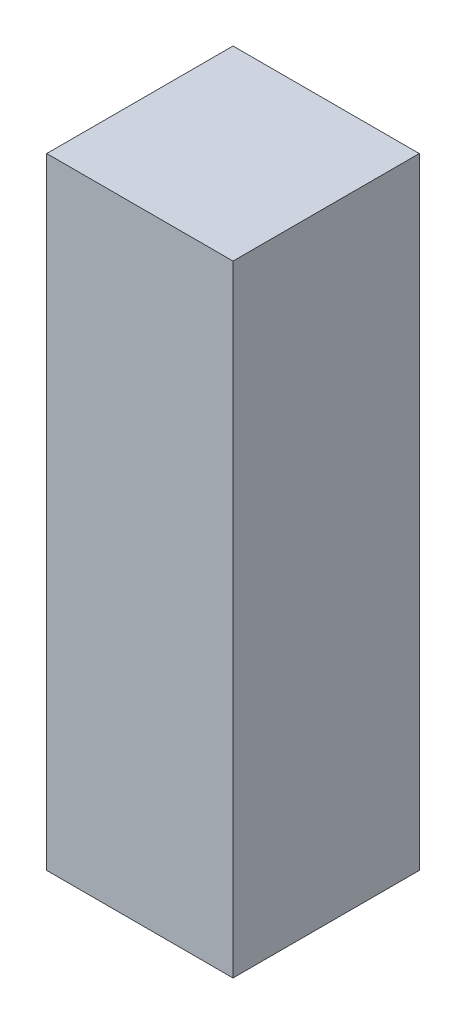
ISO-10303-21;
HEADER;
FILE_DESCRIPTION(('STEP AP214'),'2;1');
FILE_NAME('part.step','',(''),(''),'','','');
FILE_SCHEMA(('AUTOMOTIVE_DESIGN { 1 0 10303 214 1 1 1 1 }'));
ENDSEC;
DATA;
#1=APPLICATION_CONTEXT('core data for automotive mechanical design processes');
#2=APPLICATION_PROTOCOL_DEFINITION('international standard','automotive_design',2000,#1);
#3=PRODUCT_CONTEXT('',#1,'mechanical');
#4=PRODUCT('Part','Part','',(#3));
#5=PRODUCT_RELATED_PRODUCT_CATEGORY('part','',(#4));
#6=PRODUCT_DEFINITION_FORMATION('','',#4);
#7=PRODUCT_DEFINITION_CONTEXT('part definition',#1,'design');
#8=PRODUCT_DEFINITION('design','',#6,#7);
#9=PRODUCT_DEFINITION_SHAPE('','',#8);
#10=(LENGTH_UNIT() NAMED_UNIT(*) SI_UNIT(.MILLI.,.METRE.));
#11=(NAMED_UNIT(*) PLANE_ANGLE_UNIT() SI_UNIT($,.RADIAN.));
#12=(NAMED_UNIT(*) SI_UNIT($,.STERADIAN.) SOLID_ANGLE_UNIT());
#13=UNCERTAINTY_MEASURE_WITH_UNIT(LENGTH_MEASURE(1.E-05),#10,'distance_accuracy_value','');
#14=(GEOMETRIC_REPRESENTATION_CONTEXT(3) GLOBAL_UNCERTAINTY_ASSIGNED_CONTEXT((#13)) GLOBAL_UNIT_ASSIGNED_CONTEXT((#10,
#11,#12)) REPRESENTATION_CONTEXT('',''));
#15=CARTESIAN_POINT('',(0.,0.,0.));
#16=DIRECTION('',(0.,0.,1.));
#17=DIRECTION('',(1.,0.,0.));
#18=AXIS2_PLACEMENT_3D('',#15,#16,#17);
#19=CARTESIAN_POINT('',(19.05,127.,19.05));
#20=DIRECTION('',(-1.,0.,0.));
#21=DIRECTION('',(0.,0.,1.));
#22=AXIS2_PLACEMENT_3D('',#19,#20,#21);
#23=PLANE('',#22);
#24=DIRECTION('',(0.,0.,-1.));
#25=VECTOR('',#24,1.);
#26=CARTESIAN_POINT('',(19.05,0.,19.05));
#27=LINE('',#26,#25);
#28=CARTESIAN_POINT('',(19.05,0.,19.05));
#29=VERTEX_POINT('',#28);
#30=CARTESIAN_POINT('',(19.05,0.,-19.05));
#31=VERTEX_POINT('',#30);
#32=EDGE_CURVE('E96',#29,#31,#27,.T.);
#33=ORIENTED_EDGE('',*,*,#32,.T.);
#34=DIRECTION('',(0.,-1.,0.));
#35=VECTOR('',#34,1.);
#36=CARTESIAN_POINT('',(19.05,127.,-19.05));
#37=LINE('',#36,#35);
#38=CARTESIAN_POINT('',(19.05,127.,-19.05));
#39=VERTEX_POINT('',#38);
#40=EDGE_CURVE('E11',#39,#31,#37,.T.);
#41=ORIENTED_EDGE('',*,*,#40,.F.);
#42=DIRECTION('',(0.,0.,-1.));
#43=VECTOR('',#42,1.);
#44=CARTESIAN_POINT('',(19.05,127.,19.05));
#45=LINE('',#44,#43);
#46=CARTESIAN_POINT('',(19.05,127.,19.05));
#47=VERTEX_POINT('',#46);
#48=EDGE_CURVE('E84',#47,#39,#45,.T.);
#49=ORIENTED_EDGE('',*,*,#48,.F.);
#50=DIRECTION('',(0.,-1.,0.));
#51=VECTOR('',#50,1.);
#52=CARTESIAN_POINT('',(19.05,127.,19.05));
#53=LINE('',#52,#51);
#54=EDGE_CURVE('E92',#47,#29,#53,.T.);
#55=ORIENTED_EDGE('',*,*,#54,.T.);
#56=EDGE_LOOP('',(#33,#41,#49,#55));
#57=FACE_BOUND('',#56,.T.);
#58=ADVANCED_FACE('F33',(#57),#23,.F.);
#59=CARTESIAN_POINT('',(-19.05,127.,-19.05));
#60=DIRECTION('',(0.,0.,1.));
#61=DIRECTION('',(1.,0.,0.));
#62=AXIS2_PLACEMENT_3D('',#59,#60,#61);
#63=PLANE('',#62);
#64=DIRECTION('',(-1.,0.,0.));
#65=VECTOR('',#64,1.);
#66=CARTESIAN_POINT('',(-19.05,0.,-19.05));
#67=LINE('',#66,#65);
#68=CARTESIAN_POINT('',(-19.05,0.,-19.05));
#69=VERTEX_POINT('',#68);
#70=EDGE_CURVE('E88',#31,#69,#67,.T.);
#71=ORIENTED_EDGE('',*,*,#70,.T.);
#72=DIRECTION('',(0.,-1.,0.));
#73=VECTOR('',#72,1.);
#74=CARTESIAN_POINT('',(-19.05,127.,-19.05));
#75=LINE('',#74,#73);
#76=CARTESIAN_POINT('',(-19.05,127.,-19.05));
#77=VERTEX_POINT('',#76);
#78=EDGE_CURVE('E41',#77,#69,#75,.T.);
#79=ORIENTED_EDGE('',*,*,#78,.F.);
#80=DIRECTION('',(-1.,0.,0.));
#81=VECTOR('',#80,1.);
#82=CARTESIAN_POINT('',(-19.05,127.,-19.05));
#83=LINE('',#82,#81);
#84=EDGE_CURVE('E79',#39,#77,#83,.T.);
#85=ORIENTED_EDGE('',*,*,#84,.F.);
#86=ORIENTED_EDGE('',*,*,#40,.T.);
#87=EDGE_LOOP('',(#71,#79,#85,#86));
#88=FACE_BOUND('',#87,.T.);
#89=ADVANCED_FACE('F87',(#88),#63,.F.);
#90=CARTESIAN_POINT('',(-19.05,127.,19.05));
#91=DIRECTION('',(1.,0.,0.));
#92=DIRECTION('',(0.,0.,-1.));
#93=AXIS2_PLACEMENT_3D('',#90,#91,#92);
#94=PLANE('',#93);
#95=DIRECTION('',(0.,0.,1.));
#96=VECTOR('',#95,1.);
#97=CARTESIAN_POINT('',(-19.05,0.,19.05));
#98=LINE('',#97,#96);
#99=CARTESIAN_POINT('',(-19.05,0.,19.05));
#100=VERTEX_POINT('',#99);
#101=EDGE_CURVE('E66',#69,#100,#98,.T.);
#102=ORIENTED_EDGE('',*,*,#101,.T.);
#103=DIRECTION('',(0.,-1.,0.));
#104=VECTOR('',#103,1.);
#105=CARTESIAN_POINT('',(-19.05,127.,19.05));
#106=LINE('',#105,#104);
#107=CARTESIAN_POINT('',(-19.05,127.,19.05));
#108=VERTEX_POINT('',#107);
#109=EDGE_CURVE('E89',#108,#100,#106,.T.);
#110=ORIENTED_EDGE('',*,*,#109,.F.);
#111=DIRECTION('',(0.,0.,1.));
#112=VECTOR('',#111,1.);
#113=CARTESIAN_POINT('',(-19.05,127.,19.05));
#114=LINE('',#113,#112);
#115=EDGE_CURVE('E82',#77,#108,#114,.T.);
#116=ORIENTED_EDGE('',*,*,#115,.F.);
#117=ORIENTED_EDGE('',*,*,#78,.T.);
#118=EDGE_LOOP('',(#102,#110,#116,#117));
#119=FACE_BOUND('',#118,.T.);
#120=ADVANCED_FACE('F90',(#119),#94,.F.);
#121=CARTESIAN_POINT('',(-19.05,127.,19.05));
#122=DIRECTION('',(0.,0.,-1.));
#123=DIRECTION('',(-1.,0.,0.));
#124=AXIS2_PLACEMENT_3D('',#121,#122,#123);
#125=PLANE('',#124);
#126=DIRECTION('',(1.,0.,0.));
#127=VECTOR('',#126,1.);
#128=CARTESIAN_POINT('',(-19.05,0.,19.05));
#129=LINE('',#128,#127);
#130=EDGE_CURVE('E72',#100,#29,#129,.T.);
#131=ORIENTED_EDGE('',*,*,#130,.T.);
#132=ORIENTED_EDGE('',*,*,#54,.F.);
#133=DIRECTION('',(1.,0.,0.));
#134=VECTOR('',#133,1.);
#135=CARTESIAN_POINT('',(-19.05,127.,19.05));
#136=LINE('',#135,#134);
#137=EDGE_CURVE('E49',#108,#47,#136,.T.);
#138=ORIENTED_EDGE('',*,*,#137,.F.);
#139=ORIENTED_EDGE('',*,*,#109,.T.);
#140=EDGE_LOOP('',(#131,#132,#138,#139));
#141=FACE_BOUND('',#140,.T.);
#142=ADVANCED_FACE('F103',(#141),#125,.F.);
#143=CARTESIAN_POINT('',(0.,127.,0.));
#144=DIRECTION('',(0.,-1.,0.));
#145=DIRECTION('',(0.,0.,-1.));
#146=AXIS2_PLACEMENT_3D('',#143,#144,#145);
#147=PLANE('',#146);
#148=ORIENTED_EDGE('',*,*,#48,.T.);
#149=ORIENTED_EDGE('',*,*,#84,.T.);
#150=ORIENTED_EDGE('',*,*,#115,.T.);
#151=ORIENTED_EDGE('',*,*,#137,.T.);
#152=EDGE_LOOP('',(#148,#149,#150,#151));
#153=FACE_BOUND('',#152,.T.);
#154=ADVANCED_FACE('F80',(#153),#147,.F.);
#155=CARTESIAN_POINT('',(0.,0.,0.));
#156=DIRECTION('',(0.,-1.,0.));
#157=DIRECTION('',(0.,0.,-1.));
#158=AXIS2_PLACEMENT_3D('',#155,#156,#157);
#159=PLANE('',#158);
#160=ORIENTED_EDGE('',*,*,#32,.F.);
#161=ORIENTED_EDGE('',*,*,#130,.F.);
#162=ORIENTED_EDGE('',*,*,#101,.F.);
#163=ORIENTED_EDGE('',*,*,#70,.F.);
#164=EDGE_LOOP('',(#160,#161,#162,#163));
#165=FACE_BOUND('',#164,.T.);
#166=ADVANCED_FACE('F106',(#165),#159,.T.);
#167=CLOSED_SHELL('',(#58,#89,#120,#142,#154,#166));
#168=MANIFOLD_SOLID_BREP('B2',#167);
#169=ADVANCED_BREP_SHAPE_REPRESENTATION('',(#18,#168),#14);
#170=SHAPE_DEFINITION_REPRESENTATION(#9,#169);
ENDSEC;
END-ISO-10303-21;
